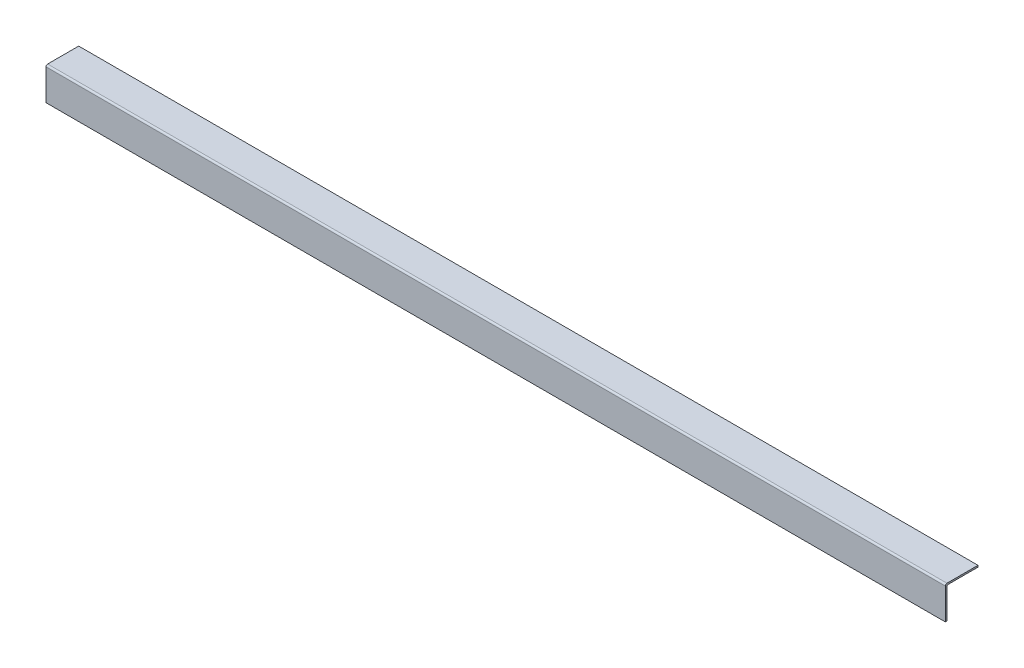
ISO-10303-21;
HEADER;
FILE_DESCRIPTION(('STEP AP214'),'2;1');
FILE_NAME('part.step','',(''),(''),'','','');
FILE_SCHEMA(('AUTOMOTIVE_DESIGN { 1 0 10303 214 1 1 1 1 }'));
ENDSEC;
DATA;
#1=APPLICATION_CONTEXT('core data for automotive mechanical design processes');
#2=APPLICATION_PROTOCOL_DEFINITION('international standard','automotive_design',2000,#1);
#3=PRODUCT_CONTEXT('',#1,'mechanical');
#4=PRODUCT('Part','Part','',(#3));
#5=PRODUCT_RELATED_PRODUCT_CATEGORY('part','',(#4));
#6=PRODUCT_DEFINITION_FORMATION('','',#4);
#7=PRODUCT_DEFINITION_CONTEXT('part definition',#1,'design');
#8=PRODUCT_DEFINITION('design','',#6,#7);
#9=PRODUCT_DEFINITION_SHAPE('','',#8);
#10=(LENGTH_UNIT() NAMED_UNIT(*) SI_UNIT(.MILLI.,.METRE.));
#11=(NAMED_UNIT(*) PLANE_ANGLE_UNIT() SI_UNIT($,.RADIAN.));
#12=(NAMED_UNIT(*) SI_UNIT($,.STERADIAN.) SOLID_ANGLE_UNIT());
#13=UNCERTAINTY_MEASURE_WITH_UNIT(LENGTH_MEASURE(1.E-05),#10,'distance_accuracy_value','');
#14=(GEOMETRIC_REPRESENTATION_CONTEXT(3) GLOBAL_UNCERTAINTY_ASSIGNED_CONTEXT((#13)) GLOBAL_UNIT_ASSIGNED_CONTEXT((#10,
#11,#12)) REPRESENTATION_CONTEXT('',''));
#15=CARTESIAN_POINT('',(0.,0.,0.));
#16=DIRECTION('',(0.,0.,1.));
#17=DIRECTION('',(1.,0.,0.));
#18=AXIS2_PLACEMENT_3D('',#15,#16,#17);
#19=CARTESIAN_POINT('',(-137.5,-10.,0.));
#20=DIRECTION('',(0.,-1.,0.));
#21=DIRECTION('',(0.,0.,-1.));
#22=AXIS2_PLACEMENT_3D('',#19,#20,#21);
#23=PLANE('',#22);
#24=DIRECTION('',(1.,0.,0.));
#25=VECTOR('',#24,1.);
#26=CARTESIAN_POINT('',(-137.5,-10.,-0.5));
#27=LINE('',#26,#25);
#28=CARTESIAN_POINT('',(-137.5,-10.,-0.5));
#29=VERTEX_POINT('',#28);
#30=CARTESIAN_POINT('',(137.5,-10.,-0.5));
#31=VERTEX_POINT('',#30);
#32=EDGE_CURVE('E48',#29,#31,#27,.T.);
#33=ORIENTED_EDGE('',*,*,#32,.T.);
#34=DIRECTION('',(0.,0.,-1.));
#35=VECTOR('',#34,1.);
#36=CARTESIAN_POINT('',(137.5,-10.,0.));
#37=LINE('',#36,#35);
#38=CARTESIAN_POINT('',(137.5,-10.,0.));
#39=VERTEX_POINT('',#38);
#40=EDGE_CURVE('E110',#39,#31,#37,.T.);
#41=ORIENTED_EDGE('',*,*,#40,.F.);
#42=DIRECTION('',(1.,0.,0.));
#43=VECTOR('',#42,1.);
#44=CARTESIAN_POINT('',(-137.5,-10.,0.));
#45=LINE('',#44,#43);
#46=CARTESIAN_POINT('',(-137.5,-10.,0.));
#47=VERTEX_POINT('',#46);
#48=EDGE_CURVE('E11',#47,#39,#45,.T.);
#49=ORIENTED_EDGE('',*,*,#48,.F.);
#50=DIRECTION('',(0.,0.,-1.));
#51=VECTOR('',#50,1.);
#52=CARTESIAN_POINT('',(-137.5,-10.,0.));
#53=LINE('',#52,#51);
#54=EDGE_CURVE('E111',#47,#29,#53,.T.);
#55=ORIENTED_EDGE('',*,*,#54,.T.);
#56=EDGE_LOOP('',(#33,#41,#49,#55));
#57=FACE_BOUND('',#56,.T.);
#58=ADVANCED_FACE('F45',(#57),#23,.T.);
#59=CARTESIAN_POINT('',(-137.5,-10.,0.));
#60=DIRECTION('',(0.,0.,1.));
#61=DIRECTION('',(1.,0.,0.));
#62=AXIS2_PLACEMENT_3D('',#59,#60,#61);
#63=PLANE('',#62);
#64=ORIENTED_EDGE('',*,*,#48,.T.);
#65=DIRECTION('',(0.,-1.,0.));
#66=VECTOR('',#65,1.);
#67=CARTESIAN_POINT('',(137.5,-10.,0.));
#68=LINE('',#67,#66);
#69=CARTESIAN_POINT('',(137.5,-0.500000000000004,0.));
#70=VERTEX_POINT('',#69);
#71=EDGE_CURVE('E130',#70,#39,#68,.T.);
#72=ORIENTED_EDGE('',*,*,#71,.F.);
#73=DIRECTION('',(1.,0.,0.));
#74=VECTOR('',#73,1.);
#75=CARTESIAN_POINT('',(-137.5,-0.500000000000004,0.));
#76=LINE('',#75,#74);
#77=CARTESIAN_POINT('',(-137.5,-0.500000000000004,0.));
#78=VERTEX_POINT('',#77);
#79=EDGE_CURVE('E54',#78,#70,#76,.T.);
#80=ORIENTED_EDGE('',*,*,#79,.F.);
#81=DIRECTION('',(0.,-1.,0.));
#82=VECTOR('',#81,1.);
#83=CARTESIAN_POINT('',(-137.5,-10.,0.));
#84=LINE('',#83,#82);
#85=EDGE_CURVE('E117',#78,#47,#84,.T.);
#86=ORIENTED_EDGE('',*,*,#85,.T.);
#87=EDGE_LOOP('',(#64,#72,#80,#86));
#88=FACE_BOUND('',#87,.T.);
#89=ADVANCED_FACE('F215',(#88),#63,.T.);
#90=CARTESIAN_POINT('',(-137.5,-0.5,-0.5));
#91=DIRECTION('',(1.,0.,0.));
#92=DIRECTION('',(0.,0.,-1.));
#93=AXIS2_PLACEMENT_3D('',#90,#91,#92);
#94=CYLINDRICAL_SURFACE('',#93,0.5);
#95=ORIENTED_EDGE('',*,*,#79,.T.);
#96=CARTESIAN_POINT('',(137.5,-0.5,-0.5));
#97=DIRECTION('',(1.,0.,0.));
#98=DIRECTION('',(0.,0.,1.));
#99=AXIS2_PLACEMENT_3D('',#96,#97,#98);
#100=CIRCLE('',#99,0.5);
#101=CARTESIAN_POINT('',(137.5,0.,-0.500000000000003));
#102=VERTEX_POINT('',#101);
#103=EDGE_CURVE('E148',#102,#70,#100,.T.);
#104=ORIENTED_EDGE('',*,*,#103,.F.);
#105=DIRECTION('',(1.,0.,0.));
#106=VECTOR('',#105,1.);
#107=CARTESIAN_POINT('',(-137.5,0.,-0.500000000000003));
#108=LINE('',#107,#106);
#109=CARTESIAN_POINT('',(-137.5,0.,-0.500000000000003));
#110=VERTEX_POINT('',#109);
#111=EDGE_CURVE('E181',#110,#102,#108,.T.);
#112=ORIENTED_EDGE('',*,*,#111,.F.);
#113=CARTESIAN_POINT('',(-137.5,-0.5,-0.5));
#114=DIRECTION('',(1.,0.,0.));
#115=DIRECTION('',(0.,0.,1.));
#116=AXIS2_PLACEMENT_3D('',#113,#114,#115);
#117=CIRCLE('',#116,0.5);
#118=EDGE_CURVE('E174',#110,#78,#117,.T.);
#119=ORIENTED_EDGE('',*,*,#118,.T.);
#120=EDGE_LOOP('',(#95,#104,#112,#119));
#121=FACE_BOUND('',#120,.T.);
#122=ADVANCED_FACE('F214',(#121),#94,.T.);
#123=CARTESIAN_POINT('',(-137.5,0.,-0.500000000000004));
#124=DIRECTION('',(0.,1.,0.));
#125=DIRECTION('',(0.,0.,1.));
#126=AXIS2_PLACEMENT_3D('',#123,#124,#125);
#127=PLANE('',#126);
#128=ORIENTED_EDGE('',*,*,#111,.T.);
#129=DIRECTION('',(0.,0.,1.));
#130=VECTOR('',#129,1.);
#131=CARTESIAN_POINT('',(137.5,0.,-0.500000000000004));
#132=LINE('',#131,#130);
#133=CARTESIAN_POINT('',(137.5,0.,-10.));
#134=VERTEX_POINT('',#133);
#135=EDGE_CURVE('E144',#134,#102,#132,.T.);
#136=ORIENTED_EDGE('',*,*,#135,.F.);
#137=DIRECTION('',(1.,0.,0.));
#138=VECTOR('',#137,1.);
#139=CARTESIAN_POINT('',(-137.5,0.,-10.));
#140=LINE('',#139,#138);
#141=CARTESIAN_POINT('',(-137.5,0.,-10.));
#142=VERTEX_POINT('',#141);
#143=EDGE_CURVE('E184',#142,#134,#140,.T.);
#144=ORIENTED_EDGE('',*,*,#143,.F.);
#145=DIRECTION('',(0.,0.,1.));
#146=VECTOR('',#145,1.);
#147=CARTESIAN_POINT('',(-137.5,0.,-0.500000000000004));
#148=LINE('',#147,#146);
#149=EDGE_CURVE('E170',#142,#110,#148,.T.);
#150=ORIENTED_EDGE('',*,*,#149,.T.);
#151=EDGE_LOOP('',(#128,#136,#144,#150));
#152=FACE_BOUND('',#151,.T.);
#153=ADVANCED_FACE('F210',(#152),#127,.T.);
#154=CARTESIAN_POINT('',(-137.5,0.,-10.));
#155=DIRECTION('',(0.,0.,-1.));
#156=DIRECTION('',(-1.,0.,0.));
#157=AXIS2_PLACEMENT_3D('',#154,#155,#156);
#158=PLANE('',#157);
#159=ORIENTED_EDGE('',*,*,#143,.T.);
#160=DIRECTION('',(0.,1.,0.));
#161=VECTOR('',#160,1.);
#162=CARTESIAN_POINT('',(137.5,0.,-10.));
#163=LINE('',#162,#161);
#164=CARTESIAN_POINT('',(137.5,-0.5,-10.));
#165=VERTEX_POINT('',#164);
#166=EDGE_CURVE('E140',#165,#134,#163,.T.);
#167=ORIENTED_EDGE('',*,*,#166,.F.);
#168=DIRECTION('',(1.,0.,0.));
#169=VECTOR('',#168,1.);
#170=CARTESIAN_POINT('',(-137.5,-0.5,-10.));
#171=LINE('',#170,#169);
#172=CARTESIAN_POINT('',(-137.5,-0.5,-10.));
#173=VERTEX_POINT('',#172);
#174=EDGE_CURVE('E187',#173,#165,#171,.T.);
#175=ORIENTED_EDGE('',*,*,#174,.F.);
#176=DIRECTION('',(0.,1.,0.));
#177=VECTOR('',#176,1.);
#178=CARTESIAN_POINT('',(-137.5,0.,-10.));
#179=LINE('',#178,#177);
#180=EDGE_CURVE('E166',#173,#142,#179,.T.);
#181=ORIENTED_EDGE('',*,*,#180,.T.);
#182=EDGE_LOOP('',(#159,#167,#175,#181));
#183=FACE_BOUND('',#182,.T.);
#184=ADVANCED_FACE('F203',(#183),#158,.T.);
#185=CARTESIAN_POINT('',(-137.5,-0.5,-10.));
#186=DIRECTION('',(0.,-1.,0.));
#187=DIRECTION('',(0.,0.,-1.));
#188=AXIS2_PLACEMENT_3D('',#185,#186,#187);
#189=PLANE('',#188);
#190=ORIENTED_EDGE('',*,*,#174,.T.);
#191=DIRECTION('',(0.,0.,-1.));
#192=VECTOR('',#191,1.);
#193=CARTESIAN_POINT('',(137.5,-0.5,-10.));
#194=LINE('',#193,#192);
#195=CARTESIAN_POINT('',(137.5,-0.5,-1.));
#196=VERTEX_POINT('',#195);
#197=EDGE_CURVE('E136',#196,#165,#194,.T.);
#198=ORIENTED_EDGE('',*,*,#197,.F.);
#199=DIRECTION('',(1.,0.,0.));
#200=VECTOR('',#199,1.);
#201=CARTESIAN_POINT('',(-137.5,-0.5,-1.));
#202=LINE('',#201,#200);
#203=CARTESIAN_POINT('',(-137.5,-0.5,-1.));
#204=VERTEX_POINT('',#203);
#205=EDGE_CURVE('E190',#204,#196,#202,.T.);
#206=ORIENTED_EDGE('',*,*,#205,.F.);
#207=DIRECTION('',(0.,0.,-1.));
#208=VECTOR('',#207,1.);
#209=CARTESIAN_POINT('',(-137.5,-0.5,-10.));
#210=LINE('',#209,#208);
#211=EDGE_CURVE('E162',#204,#173,#210,.T.);
#212=ORIENTED_EDGE('',*,*,#211,.T.);
#213=EDGE_LOOP('',(#190,#198,#206,#212));
#214=FACE_BOUND('',#213,.T.);
#215=ADVANCED_FACE('F200',(#214),#189,.T.);
#216=CARTESIAN_POINT('',(-137.5,-1.,-1.));
#217=DIRECTION('',(1.,0.,0.));
#218=DIRECTION('',(0.,0.,-1.));
#219=AXIS2_PLACEMENT_3D('',#216,#217,#218);
#220=CYLINDRICAL_SURFACE('',#219,0.5);
#221=ORIENTED_EDGE('',*,*,#205,.T.);
#222=CARTESIAN_POINT('',(137.5,-1.,-1.));
#223=DIRECTION('',(-1.,0.,0.));
#224=DIRECTION('',(0.,0.,-1.));
#225=AXIS2_PLACEMENT_3D('',#222,#223,#224);
#226=CIRCLE('',#225,0.5);
#227=CARTESIAN_POINT('',(137.5,-1.,-0.5));
#228=VERTEX_POINT('',#227);
#229=EDGE_CURVE('E125',#228,#196,#226,.T.);
#230=ORIENTED_EDGE('',*,*,#229,.F.);
#231=DIRECTION('',(1.,0.,0.));
#232=VECTOR('',#231,1.);
#233=CARTESIAN_POINT('',(-137.5,-1.,-0.5));
#234=LINE('',#233,#232);
#235=CARTESIAN_POINT('',(-137.5,-1.,-0.5));
#236=VERTEX_POINT('',#235);
#237=EDGE_CURVE('E116',#236,#228,#234,.T.);
#238=ORIENTED_EDGE('',*,*,#237,.F.);
#239=CARTESIAN_POINT('',(-137.5,-1.,-1.));
#240=DIRECTION('',(-1.,0.,0.));
#241=DIRECTION('',(0.,0.,-1.));
#242=AXIS2_PLACEMENT_3D('',#239,#240,#241);
#243=CIRCLE('',#242,0.5);
#244=EDGE_CURVE('E158',#236,#204,#243,.T.);
#245=ORIENTED_EDGE('',*,*,#244,.T.);
#246=EDGE_LOOP('',(#221,#230,#238,#245));
#247=FACE_BOUND('',#246,.T.);
#248=ADVANCED_FACE('F194',(#247),#220,.F.);
#249=CARTESIAN_POINT('',(-137.5,-10.,-0.5));
#250=DIRECTION('',(0.,0.,-1.));
#251=DIRECTION('',(-1.,0.,0.));
#252=AXIS2_PLACEMENT_3D('',#249,#250,#251);
#253=PLANE('',#252);
#254=ORIENTED_EDGE('',*,*,#237,.T.);
#255=DIRECTION('',(0.,1.,0.));
#256=VECTOR('',#255,1.);
#257=CARTESIAN_POINT('',(137.5,-10.,-0.5));
#258=LINE('',#257,#256);
#259=EDGE_CURVE('E119',#31,#228,#258,.T.);
#260=ORIENTED_EDGE('',*,*,#259,.F.);
#261=ORIENTED_EDGE('',*,*,#32,.F.);
#262=DIRECTION('',(0.,1.,0.));
#263=VECTOR('',#262,1.);
#264=CARTESIAN_POINT('',(-137.5,-10.,-0.5));
#265=LINE('',#264,#263);
#266=EDGE_CURVE('E155',#29,#236,#265,.T.);
#267=ORIENTED_EDGE('',*,*,#266,.T.);
#268=EDGE_LOOP('',(#254,#260,#261,#267));
#269=FACE_BOUND('',#268,.T.);
#270=ADVANCED_FACE('F120',(#269),#253,.T.);
#271=CARTESIAN_POINT('',(-137.5,-1.,-1.));
#272=DIRECTION('',(1.,0.,0.));
#273=DIRECTION('',(0.,0.,-1.));
#274=AXIS2_PLACEMENT_3D('',#271,#272,#273);
#275=PLANE('',#274);
#276=ORIENTED_EDGE('',*,*,#54,.F.);
#277=ORIENTED_EDGE('',*,*,#85,.F.);
#278=ORIENTED_EDGE('',*,*,#118,.F.);
#279=ORIENTED_EDGE('',*,*,#149,.F.);
#280=ORIENTED_EDGE('',*,*,#180,.F.);
#281=ORIENTED_EDGE('',*,*,#211,.F.);
#282=ORIENTED_EDGE('',*,*,#244,.F.);
#283=ORIENTED_EDGE('',*,*,#266,.F.);
#284=EDGE_LOOP('',(#276,#277,#278,#279,#280,#281,#282,#283));
#285=FACE_BOUND('',#284,.T.);
#286=ADVANCED_FACE('F206',(#285),#275,.F.);
#287=CARTESIAN_POINT('',(137.5,-1.,-1.));
#288=DIRECTION('',(1.,0.,0.));
#289=DIRECTION('',(0.,0.,-1.));
#290=AXIS2_PLACEMENT_3D('',#287,#288,#289);
#291=PLANE('',#290);
#292=ORIENTED_EDGE('',*,*,#40,.T.);
#293=ORIENTED_EDGE('',*,*,#259,.T.);
#294=ORIENTED_EDGE('',*,*,#229,.T.);
#295=ORIENTED_EDGE('',*,*,#197,.T.);
#296=ORIENTED_EDGE('',*,*,#166,.T.);
#297=ORIENTED_EDGE('',*,*,#135,.T.);
#298=ORIENTED_EDGE('',*,*,#103,.T.);
#299=ORIENTED_EDGE('',*,*,#71,.T.);
#300=EDGE_LOOP('',(#292,#293,#294,#295,#296,#297,#298,#299));
#301=FACE_BOUND('',#300,.T.);
#302=ADVANCED_FACE('F128',(#301),#291,.T.);
#303=CLOSED_SHELL('',(#58,#89,#122,#153,#184,#215,#248,#270,#286,#302));
#304=MANIFOLD_SOLID_BREP('B2',#303);
#305=ADVANCED_BREP_SHAPE_REPRESENTATION('',(#18,#304),#14);
#306=SHAPE_DEFINITION_REPRESENTATION(#9,#305);
ENDSEC;
END-ISO-10303-21;
